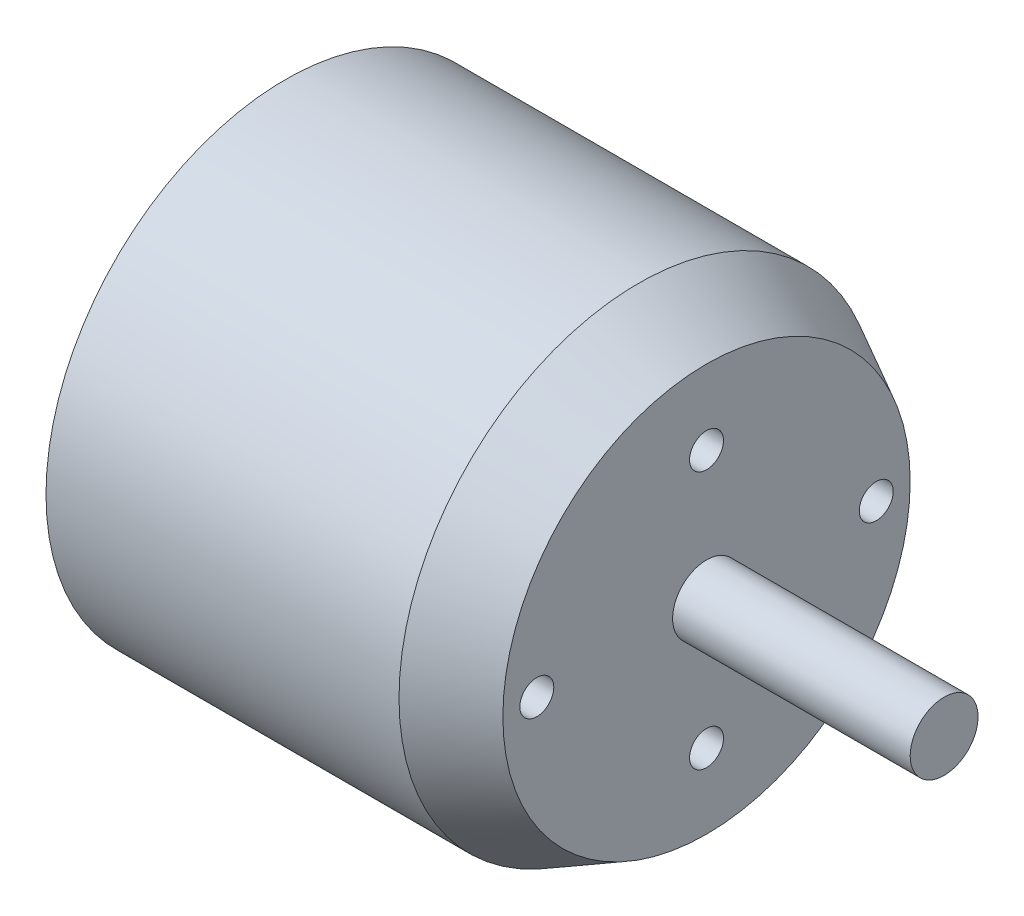
ISO-10303-21;
HEADER;
FILE_DESCRIPTION(('STEP AP214'),'2;1');
FILE_NAME('part.step','',(''),(''),'','','');
FILE_SCHEMA(('AUTOMOTIVE_DESIGN { 1 0 10303 214 1 1 1 1 }'));
ENDSEC;
DATA;
#1=APPLICATION_CONTEXT('core data for automotive mechanical design processes');
#2=APPLICATION_PROTOCOL_DEFINITION('international standard','automotive_design',2000,#1);
#3=PRODUCT_CONTEXT('',#1,'mechanical');
#4=PRODUCT('Part','Part','',(#3));
#5=PRODUCT_RELATED_PRODUCT_CATEGORY('part','',(#4));
#6=PRODUCT_DEFINITION_FORMATION('','',#4);
#7=PRODUCT_DEFINITION_CONTEXT('part definition',#1,'design');
#8=PRODUCT_DEFINITION('design','',#6,#7);
#9=PRODUCT_DEFINITION_SHAPE('','',#8);
#10=(LENGTH_UNIT() NAMED_UNIT(*) SI_UNIT(.MILLI.,.METRE.));
#11=(NAMED_UNIT(*) PLANE_ANGLE_UNIT() SI_UNIT($,.RADIAN.));
#12=(NAMED_UNIT(*) SI_UNIT($,.STERADIAN.) SOLID_ANGLE_UNIT());
#13=UNCERTAINTY_MEASURE_WITH_UNIT(LENGTH_MEASURE(1.E-05),#10,'distance_accuracy_value','');
#14=(GEOMETRIC_REPRESENTATION_CONTEXT(3) GLOBAL_UNCERTAINTY_ASSIGNED_CONTEXT((#13)) GLOBAL_UNIT_ASSIGNED_CONTEXT((#10,
#11,#12)) REPRESENTATION_CONTEXT('',''));
#15=CARTESIAN_POINT('',(0.,0.,0.));
#16=DIRECTION('',(0.,0.,1.));
#17=DIRECTION('',(1.,0.,0.));
#18=AXIS2_PLACEMENT_3D('',#15,#16,#17);
#19=CARTESIAN_POINT('',(0.,0.,0.));
#20=DIRECTION('',(1.,0.,0.));
#21=DIRECTION('',(0.,0.,-1.));
#22=AXIS2_PLACEMENT_3D('',#19,#20,#21);
#23=PLANE('',#22);
#24=CARTESIAN_POINT('',(0.,9.5,0.));
#25=DIRECTION('',(1.,0.,0.));
#26=DIRECTION('',(0.,0.,-1.));
#27=AXIS2_PLACEMENT_3D('',#24,#25,#26);
#28=CIRCLE('',#27,1.25);
#29=CARTESIAN_POINT('',(0.,9.5,-1.25));
#30=VERTEX_POINT('',#29);
#31=EDGE_CURVE('E79',#30,#30,#28,.T.);
#32=ORIENTED_EDGE('',*,*,#31,.F.);
#33=EDGE_LOOP('',(#32));
#34=FACE_BOUND('',#33,.T.);
#35=CARTESIAN_POINT('',(0.,-9.5,0.));
#36=DIRECTION('',(1.,0.,0.));
#37=DIRECTION('',(0.,0.,-1.));
#38=AXIS2_PLACEMENT_3D('',#35,#36,#37);
#39=CIRCLE('',#38,1.25);
#40=CARTESIAN_POINT('',(0.,-9.5,-1.25));
#41=VERTEX_POINT('',#40);
#42=EDGE_CURVE('E76',#41,#41,#39,.T.);
#43=ORIENTED_EDGE('',*,*,#42,.F.);
#44=EDGE_LOOP('',(#43));
#45=FACE_BOUND('',#44,.T.);
#46=CARTESIAN_POINT('',(0.,0.,12.5));
#47=DIRECTION('',(1.,0.,0.));
#48=DIRECTION('',(0.,0.,-1.));
#49=AXIS2_PLACEMENT_3D('',#46,#47,#48);
#50=CIRCLE('',#49,1.25);
#51=CARTESIAN_POINT('',(0.,0.,11.25));
#52=VERTEX_POINT('',#51);
#53=EDGE_CURVE('E90',#52,#52,#50,.T.);
#54=ORIENTED_EDGE('',*,*,#53,.F.);
#55=EDGE_LOOP('',(#54));
#56=FACE_BOUND('',#55,.T.);
#57=CARTESIAN_POINT('',(0.,0.,-12.5));
#58=DIRECTION('',(1.,0.,0.));
#59=DIRECTION('',(0.,0.,-1.));
#60=AXIS2_PLACEMENT_3D('',#57,#58,#59);
#61=CIRCLE('',#60,1.25);
#62=CARTESIAN_POINT('',(0.,0.,-13.75));
#63=VERTEX_POINT('',#62);
#64=EDGE_CURVE('E92',#63,#63,#61,.T.);
#65=ORIENTED_EDGE('',*,*,#64,.F.);
#66=EDGE_LOOP('',(#65));
#67=FACE_BOUND('',#66,.T.);
#68=CARTESIAN_POINT('',(0.,0.,0.));
#69=DIRECTION('',(-1.,0.,0.));
#70=DIRECTION('',(0.,0.,1.));
#71=AXIS2_PLACEMENT_3D('',#68,#69,#70);
#72=CIRCLE('',#71,2.5);
#73=CARTESIAN_POINT('',(0.,0.,2.5));
#74=VERTEX_POINT('',#73);
#75=EDGE_CURVE('E103',#74,#74,#72,.T.);
#76=ORIENTED_EDGE('',*,*,#75,.T.);
#77=EDGE_LOOP('',(#76));
#78=FACE_BOUND('',#77,.T.);
#79=CARTESIAN_POINT('',(0.,0.,0.));
#80=DIRECTION('',(-1.,0.,0.));
#81=DIRECTION('',(0.,0.,1.));
#82=AXIS2_PLACEMENT_3D('',#79,#80,#81);
#83=CIRCLE('',#82,15.);
#84=CARTESIAN_POINT('',(0.,0.,15.));
#85=VERTEX_POINT('',#84);
#86=EDGE_CURVE('E49',#85,#85,#83,.T.);
#87=ORIENTED_EDGE('',*,*,#86,.F.);
#88=EDGE_LOOP('',(#87));
#89=FACE_BOUND('',#88,.T.);
#90=ADVANCED_FACE('F50',(#34,#45,#56,#67,#78,#89),#23,.T.);
#91=CARTESIAN_POINT('',(0.,0.,0.));
#92=DIRECTION('',(-1.,0.,0.));
#93=DIRECTION('',(0.,0.,1.));
#94=AXIS2_PLACEMENT_3D('',#91,#92,#93);
#95=CONICAL_SURFACE('',#94,15.,0.48735857950519);
#96=CARTESIAN_POINT('',(-5.,0.,0.));
#97=DIRECTION('',(-1.,0.,0.));
#98=DIRECTION('',(0.,0.,1.));
#99=AXIS2_PLACEMENT_3D('',#96,#97,#98);
#100=CIRCLE('',#99,17.65);
#101=CARTESIAN_POINT('',(-5.,0.,17.65));
#102=VERTEX_POINT('',#101);
#103=EDGE_CURVE('E113',#102,#102,#100,.T.);
#104=ORIENTED_EDGE('',*,*,#103,.F.);
#105=EDGE_LOOP('',(#104));
#106=FACE_BOUND('',#105,.T.);
#107=ORIENTED_EDGE('',*,*,#86,.T.);
#108=EDGE_LOOP('',(#107));
#109=FACE_BOUND('',#108,.T.);
#110=ADVANCED_FACE('F124',(#106,#109),#95,.T.);
#111=CARTESIAN_POINT('',(1.2272727272931,0.,0.));
#112=DIRECTION('',(-1.,0.,0.));
#113=DIRECTION('',(0.,0.,1.));
#114=AXIS2_PLACEMENT_3D('',#111,#112,#113);
#115=CYLINDRICAL_SURFACE('',#114,17.65);
#116=CARTESIAN_POINT('',(-31.,0.,0.));
#117=DIRECTION('',(-1.,0.,0.));
#118=DIRECTION('',(0.,0.,1.));
#119=AXIS2_PLACEMENT_3D('',#116,#117,#118);
#120=CIRCLE('',#119,17.65);
#121=CARTESIAN_POINT('',(-31.,0.,17.65));
#122=VERTEX_POINT('',#121);
#123=EDGE_CURVE('E114',#122,#122,#120,.T.);
#124=ORIENTED_EDGE('',*,*,#123,.F.);
#125=EDGE_LOOP('',(#124));
#126=FACE_BOUND('',#125,.T.);
#127=ORIENTED_EDGE('',*,*,#103,.T.);
#128=EDGE_LOOP('',(#127));
#129=FACE_BOUND('',#128,.T.);
#130=ADVANCED_FACE('F129',(#126,#129),#115,.T.);
#131=CARTESIAN_POINT('',(-31.,0.,0.));
#132=DIRECTION('',(1.,0.,0.));
#133=DIRECTION('',(0.,0.,-1.));
#134=AXIS2_PLACEMENT_3D('',#131,#132,#133);
#135=CONICAL_SURFACE('',#134,17.65,1.236956551359);
#136=CARTESIAN_POINT('',(-34.,0.,0.));
#137=DIRECTION('',(-1.,0.,0.));
#138=DIRECTION('',(0.,0.,1.));
#139=AXIS2_PLACEMENT_3D('',#136,#137,#138);
#140=CIRCLE('',#139,9.);
#141=CARTESIAN_POINT('',(-34.,0.,9.));
#142=VERTEX_POINT('',#141);
#143=EDGE_CURVE('E109',#142,#142,#140,.T.);
#144=ORIENTED_EDGE('',*,*,#143,.F.);
#145=EDGE_LOOP('',(#144));
#146=FACE_BOUND('',#145,.T.);
#147=ORIENTED_EDGE('',*,*,#123,.T.);
#148=EDGE_LOOP('',(#147));
#149=FACE_BOUND('',#148,.T.);
#150=ADVANCED_FACE('F154',(#146,#149),#135,.T.);
#151=CARTESIAN_POINT('',(-34.,0.,0.));
#152=DIRECTION('',(-1.,0.,0.));
#153=DIRECTION('',(0.,0.,1.));
#154=AXIS2_PLACEMENT_3D('',#151,#152,#153);
#155=PLANE('',#154);
#156=CARTESIAN_POINT('',(-34.,0.,0.));
#157=DIRECTION('',(-1.,0.,0.));
#158=DIRECTION('',(0.,0.,1.));
#159=AXIS2_PLACEMENT_3D('',#156,#157,#158);
#160=CIRCLE('',#159,2.49999999999999);
#161=CARTESIAN_POINT('',(-34.,0.,2.49999999999999));
#162=VERTEX_POINT('',#161);
#163=EDGE_CURVE('E11',#162,#162,#160,.T.);
#164=ORIENTED_EDGE('',*,*,#163,.F.);
#165=EDGE_LOOP('',(#164));
#166=FACE_BOUND('',#165,.T.);
#167=ORIENTED_EDGE('',*,*,#143,.T.);
#168=EDGE_LOOP('',(#167));
#169=FACE_BOUND('',#168,.T.);
#170=ADVANCED_FACE('F147',(#166,#169),#155,.T.);
#171=CARTESIAN_POINT('',(17.5,0.,0.));
#172=DIRECTION('',(-1.,0.,0.));
#173=DIRECTION('',(0.,0.,1.));
#174=AXIS2_PLACEMENT_3D('',#171,#172,#173);
#175=PLANE('',#174);
#176=CARTESIAN_POINT('',(17.5,0.,0.));
#177=DIRECTION('',(-1.,0.,0.));
#178=DIRECTION('',(0.,0.,1.));
#179=AXIS2_PLACEMENT_3D('',#176,#177,#178);
#180=CIRCLE('',#179,2.5);
#181=CARTESIAN_POINT('',(17.5,0.,2.5));
#182=VERTEX_POINT('',#181);
#183=EDGE_CURVE('E110',#182,#182,#180,.T.);
#184=ORIENTED_EDGE('',*,*,#183,.F.);
#185=EDGE_LOOP('',(#184));
#186=FACE_BOUND('',#185,.T.);
#187=ADVANCED_FACE('F144',(#186),#175,.F.);
#188=CARTESIAN_POINT('',(1.2272727272931,0.,0.));
#189=DIRECTION('',(-1.,0.,0.));
#190=DIRECTION('',(0.,0.,1.));
#191=AXIS2_PLACEMENT_3D('',#188,#189,#190);
#192=CYLINDRICAL_SURFACE('',#191,2.5);
#193=ORIENTED_EDGE('',*,*,#75,.F.);
#194=EDGE_LOOP('',(#193));
#195=FACE_BOUND('',#194,.T.);
#196=ORIENTED_EDGE('',*,*,#183,.T.);
#197=EDGE_LOOP('',(#196));
#198=FACE_BOUND('',#197,.T.);
#199=ADVANCED_FACE('F143',(#195,#198),#192,.T.);
#200=CARTESIAN_POINT('',(1.2272727272931,0.,0.));
#201=DIRECTION('',(-1.,0.,0.));
#202=DIRECTION('',(0.,0.,1.));
#203=AXIS2_PLACEMENT_3D('',#200,#201,#202);
#204=CYLINDRICAL_SURFACE('',#203,2.49999999999999);
#205=ORIENTED_EDGE('',*,*,#163,.T.);
#206=EDGE_LOOP('',(#205));
#207=FACE_BOUND('',#206,.T.);
#208=CARTESIAN_POINT('',(-36.,0.,0.));
#209=DIRECTION('',(-1.,0.,0.));
#210=DIRECTION('',(0.,0.,1.));
#211=AXIS2_PLACEMENT_3D('',#208,#209,#210);
#212=CIRCLE('',#211,2.49999999999999);
#213=CARTESIAN_POINT('',(-36.,0.,2.49999999999999));
#214=VERTEX_POINT('',#213);
#215=EDGE_CURVE('E101',#214,#214,#212,.T.);
#216=ORIENTED_EDGE('',*,*,#215,.F.);
#217=EDGE_LOOP('',(#216));
#218=FACE_BOUND('',#217,.T.);
#219=ADVANCED_FACE('F145',(#207,#218),#204,.T.);
#220=CARTESIAN_POINT('',(-36.,0.,0.));
#221=DIRECTION('',(1.,0.,0.));
#222=DIRECTION('',(0.,0.,-1.));
#223=AXIS2_PLACEMENT_3D('',#220,#221,#222);
#224=PLANE('',#223);
#225=ORIENTED_EDGE('',*,*,#215,.T.);
#226=EDGE_LOOP('',(#225));
#227=FACE_BOUND('',#226,.T.);
#228=ADVANCED_FACE('F196',(#227),#224,.F.);
#229=CARTESIAN_POINT('',(-7.5,0.,-12.5));
#230=DIRECTION('',(1.,0.,0.));
#231=DIRECTION('',(0.,0.,-1.));
#232=AXIS2_PLACEMENT_3D('',#229,#230,#231);
#233=CONICAL_SURFACE('',#232,1.25,1.02974425867665);
#234=CARTESIAN_POINT('',(-8.25107577378445,0.,-12.5));
#235=VERTEX_POINT('',#234);
#236=VERTEX_LOOP('',#235);
#237=FACE_BOUND('',#236,.T.);
#238=CARTESIAN_POINT('',(-7.5,0.,-12.5));
#239=DIRECTION('',(1.,0.,0.));
#240=DIRECTION('',(0.,0.,-1.));
#241=AXIS2_PLACEMENT_3D('',#238,#239,#240);
#242=CIRCLE('',#241,1.25);
#243=CARTESIAN_POINT('',(-7.5,0.,-13.75));
#244=VERTEX_POINT('',#243);
#245=EDGE_CURVE('E98',#244,#244,#242,.T.);
#246=ORIENTED_EDGE('',*,*,#245,.T.);
#247=EDGE_LOOP('',(#246));
#248=FACE_BOUND('',#247,.T.);
#249=ADVANCED_FACE('F206',(#237,#248),#233,.F.);
#250=CARTESIAN_POINT('',(0.,0.,-12.5));
#251=DIRECTION('',(1.,0.,0.));
#252=DIRECTION('',(0.,0.,-1.));
#253=AXIS2_PLACEMENT_3D('',#250,#251,#252);
#254=CYLINDRICAL_SURFACE('',#253,1.25);
#255=ORIENTED_EDGE('',*,*,#245,.F.);
#256=EDGE_LOOP('',(#255));
#257=FACE_BOUND('',#256,.T.);
#258=ORIENTED_EDGE('',*,*,#64,.T.);
#259=EDGE_LOOP('',(#258));
#260=FACE_BOUND('',#259,.T.);
#261=ADVANCED_FACE('F228',(#257,#260),#254,.F.);
#262=CARTESIAN_POINT('',(-7.5,0.,12.5));
#263=DIRECTION('',(1.,0.,0.));
#264=DIRECTION('',(0.,0.,-1.));
#265=AXIS2_PLACEMENT_3D('',#262,#263,#264);
#266=CONICAL_SURFACE('',#265,1.25,1.02974425867665);
#267=CARTESIAN_POINT('',(-8.25107577378445,0.,12.5));
#268=VERTEX_POINT('',#267);
#269=VERTEX_LOOP('',#268);
#270=FACE_BOUND('',#269,.T.);
#271=CARTESIAN_POINT('',(-7.5,0.,12.5));
#272=DIRECTION('',(1.,0.,0.));
#273=DIRECTION('',(0.,0.,-1.));
#274=AXIS2_PLACEMENT_3D('',#271,#272,#273);
#275=CIRCLE('',#274,1.25);
#276=CARTESIAN_POINT('',(-7.5,0.,11.25));
#277=VERTEX_POINT('',#276);
#278=EDGE_CURVE('E95',#277,#277,#275,.T.);
#279=ORIENTED_EDGE('',*,*,#278,.T.);
#280=EDGE_LOOP('',(#279));
#281=FACE_BOUND('',#280,.T.);
#282=ADVANCED_FACE('F231',(#270,#281),#266,.F.);
#283=CARTESIAN_POINT('',(0.,0.,12.5));
#284=DIRECTION('',(1.,0.,0.));
#285=DIRECTION('',(0.,0.,-1.));
#286=AXIS2_PLACEMENT_3D('',#283,#284,#285);
#287=CYLINDRICAL_SURFACE('',#286,1.25);
#288=ORIENTED_EDGE('',*,*,#278,.F.);
#289=EDGE_LOOP('',(#288));
#290=FACE_BOUND('',#289,.T.);
#291=ORIENTED_EDGE('',*,*,#53,.T.);
#292=EDGE_LOOP('',(#291));
#293=FACE_BOUND('',#292,.T.);
#294=ADVANCED_FACE('F242',(#290,#293),#287,.F.);
#295=CARTESIAN_POINT('',(-7.5,-9.5,0.));
#296=DIRECTION('',(1.,0.,0.));
#297=DIRECTION('',(0.,0.,-1.));
#298=AXIS2_PLACEMENT_3D('',#295,#296,#297);
#299=CONICAL_SURFACE('',#298,1.25,1.02974425867665);
#300=CARTESIAN_POINT('',(-8.25107577378445,-9.5,0.));
#301=VERTEX_POINT('',#300);
#302=VERTEX_LOOP('',#301);
#303=FACE_BOUND('',#302,.T.);
#304=CARTESIAN_POINT('',(-7.5,-9.5,0.));
#305=DIRECTION('',(1.,0.,0.));
#306=DIRECTION('',(0.,0.,-1.));
#307=AXIS2_PLACEMENT_3D('',#304,#305,#306);
#308=CIRCLE('',#307,1.25);
#309=CARTESIAN_POINT('',(-7.5,-9.5,-1.25));
#310=VERTEX_POINT('',#309);
#311=EDGE_CURVE('E84',#310,#310,#308,.T.);
#312=ORIENTED_EDGE('',*,*,#311,.T.);
#313=EDGE_LOOP('',(#312));
#314=FACE_BOUND('',#313,.T.);
#315=ADVANCED_FACE('F251',(#303,#314),#299,.F.);
#316=CARTESIAN_POINT('',(0.,-9.5,0.));
#317=DIRECTION('',(1.,0.,0.));
#318=DIRECTION('',(0.,0.,-1.));
#319=AXIS2_PLACEMENT_3D('',#316,#317,#318);
#320=CYLINDRICAL_SURFACE('',#319,1.25);
#321=ORIENTED_EDGE('',*,*,#311,.F.);
#322=EDGE_LOOP('',(#321));
#323=FACE_BOUND('',#322,.T.);
#324=ORIENTED_EDGE('',*,*,#42,.T.);
#325=EDGE_LOOP('',(#324));
#326=FACE_BOUND('',#325,.T.);
#327=ADVANCED_FACE('F75',(#323,#326),#320,.F.);
#328=CARTESIAN_POINT('',(-7.5,9.5,0.));
#329=DIRECTION('',(1.,0.,0.));
#330=DIRECTION('',(0.,0.,-1.));
#331=AXIS2_PLACEMENT_3D('',#328,#329,#330);
#332=CONICAL_SURFACE('',#331,1.25,1.02974425867665);
#333=CARTESIAN_POINT('',(-8.25107577378445,9.5,0.));
#334=VERTEX_POINT('',#333);
#335=VERTEX_LOOP('',#334);
#336=FACE_BOUND('',#335,.T.);
#337=CARTESIAN_POINT('',(-7.5,9.5,0.));
#338=DIRECTION('',(1.,0.,0.));
#339=DIRECTION('',(0.,0.,-1.));
#340=AXIS2_PLACEMENT_3D('',#337,#338,#339);
#341=CIRCLE('',#340,1.25);
#342=CARTESIAN_POINT('',(-7.5,9.5,-1.25));
#343=VERTEX_POINT('',#342);
#344=EDGE_CURVE('E78',#343,#343,#341,.T.);
#345=ORIENTED_EDGE('',*,*,#344,.T.);
#346=EDGE_LOOP('',(#345));
#347=FACE_BOUND('',#346,.T.);
#348=ADVANCED_FACE('F67',(#336,#347),#332,.F.);
#349=CARTESIAN_POINT('',(0.,9.5,0.));
#350=DIRECTION('',(1.,0.,0.));
#351=DIRECTION('',(0.,0.,-1.));
#352=AXIS2_PLACEMENT_3D('',#349,#350,#351);
#353=CYLINDRICAL_SURFACE('',#352,1.25);
#354=ORIENTED_EDGE('',*,*,#344,.F.);
#355=EDGE_LOOP('',(#354));
#356=FACE_BOUND('',#355,.T.);
#357=ORIENTED_EDGE('',*,*,#31,.T.);
#358=EDGE_LOOP('',(#357));
#359=FACE_BOUND('',#358,.T.);
#360=ADVANCED_FACE('F72',(#356,#359),#353,.F.);
#361=CLOSED_SHELL('',(#90,#110,#130,#150,#170,#187,#199,#219,#228,#249,#261,#282,#294,#315,#327,
#348,#360));
#362=MANIFOLD_SOLID_BREP('B2',#361);
#363=ADVANCED_BREP_SHAPE_REPRESENTATION('',(#18,#362),#14);
#364=SHAPE_DEFINITION_REPRESENTATION(#9,#363);
ENDSEC;
END-ISO-10303-21;
